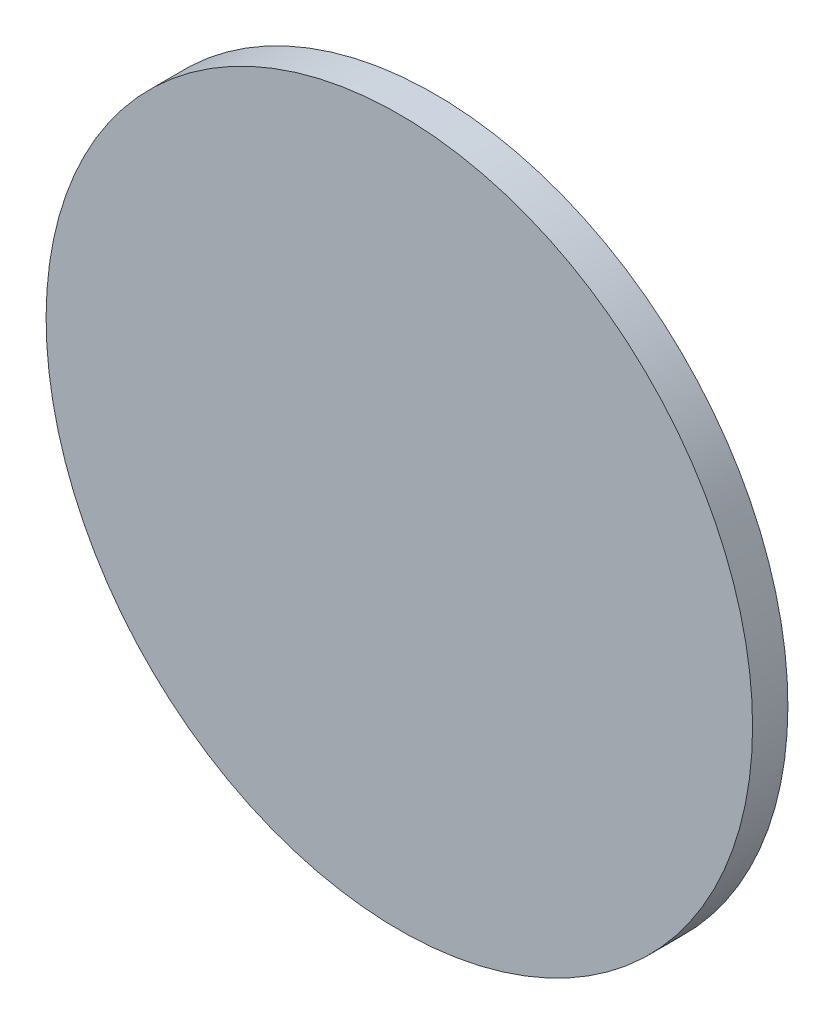
ISO-10303-21;
HEADER;
FILE_DESCRIPTION(('STEP AP214'),'2;1');
FILE_NAME('part.step','',(''),(''),'','','');
FILE_SCHEMA(('AUTOMOTIVE_DESIGN { 1 0 10303 214 1 1 1 1 }'));
ENDSEC;
DATA;
#1=APPLICATION_CONTEXT('core data for automotive mechanical design processes');
#2=APPLICATION_PROTOCOL_DEFINITION('international standard','automotive_design',2000,#1);
#3=PRODUCT_CONTEXT('',#1,'mechanical');
#4=PRODUCT('Part','Part','',(#3));
#5=PRODUCT_RELATED_PRODUCT_CATEGORY('part','',(#4));
#6=PRODUCT_DEFINITION_FORMATION('','',#4);
#7=PRODUCT_DEFINITION_CONTEXT('part definition',#1,'design');
#8=PRODUCT_DEFINITION('design','',#6,#7);
#9=PRODUCT_DEFINITION_SHAPE('','',#8);
#10=(LENGTH_UNIT() NAMED_UNIT(*) SI_UNIT(.MILLI.,.METRE.));
#11=(NAMED_UNIT(*) PLANE_ANGLE_UNIT() SI_UNIT($,.RADIAN.));
#12=(NAMED_UNIT(*) SI_UNIT($,.STERADIAN.) SOLID_ANGLE_UNIT());
#13=UNCERTAINTY_MEASURE_WITH_UNIT(LENGTH_MEASURE(1.E-05),#10,'distance_accuracy_value','');
#14=(GEOMETRIC_REPRESENTATION_CONTEXT(3) GLOBAL_UNCERTAINTY_ASSIGNED_CONTEXT((#13)) GLOBAL_UNIT_ASSIGNED_CONTEXT((#10,
#11,#12)) REPRESENTATION_CONTEXT('',''));
#15=CARTESIAN_POINT('',(0.,0.,0.));
#16=DIRECTION('',(0.,0.,1.));
#17=DIRECTION('',(1.,0.,0.));
#18=AXIS2_PLACEMENT_3D('',#15,#16,#17);
#19=CARTESIAN_POINT('',(19.8104450030768,-19.8104450030789,23.8077500000002));
#20=DIRECTION('',(0.,0.,-1.));
#21=DIRECTION('',(0.858693395429852,-0.512489661012935,0.));
#22=AXIS2_PLACEMENT_3D('',#19,#20,#21);
#23=PLANE('',#22);
#24=CARTESIAN_POINT('',(19.8104450030768,-19.8104450030789,23.8077500000002));
#25=DIRECTION('',(0.,0.,-1.));
#26=DIRECTION('',(0.858693395429852,-0.512489661012935,0.));
#27=AXIS2_PLACEMENT_3D('',#24,#25,#26);
#28=CIRCLE('',#27,6.35);
#29=CARTESIAN_POINT('',(25.2631480640563,-23.064754350511,23.8077500000002));
#30=VERTEX_POINT('',#29);
#31=EDGE_CURVE('E10',#30,#30,#28,.T.);
#32=ORIENTED_EDGE('',*,*,#31,.F.);
#33=EDGE_LOOP('',(#32));
#34=FACE_BOUND('',#33,.T.);
#35=ADVANCED_FACE('F15',(#34),#23,.F.);
#36=CARTESIAN_POINT('',(19.8104450030768,-19.8104450030789,23.1727500000002));
#37=DIRECTION('',(0.,0.,-1.));
#38=DIRECTION('',(0.858693395429852,-0.512489661012935,0.));
#39=AXIS2_PLACEMENT_3D('',#36,#37,#38);
#40=PLANE('',#39);
#41=CARTESIAN_POINT('',(19.8104450030768,-19.8104450030789,23.1727500000002));
#42=DIRECTION('',(0.,0.,-1.));
#43=DIRECTION('',(0.858693395429852,-0.512489661012935,0.));
#44=AXIS2_PLACEMENT_3D('',#41,#42,#43);
#45=CIRCLE('',#44,6.35);
#46=CARTESIAN_POINT('',(25.2631480640563,-23.064754350511,23.1727500000002));
#47=VERTEX_POINT('',#46);
#48=EDGE_CURVE('E22',#47,#47,#45,.T.);
#49=ORIENTED_EDGE('',*,*,#48,.T.);
#50=EDGE_LOOP('',(#49));
#51=FACE_BOUND('',#50,.T.);
#52=ADVANCED_FACE('F30',(#51),#40,.T.);
#53=CARTESIAN_POINT('',(19.8104450030768,-19.8104450030789,23.1727500000002));
#54=DIRECTION('',(0.,0.,1.));
#55=DIRECTION('',(-0.858693395429852,0.512489661012935,0.));
#56=AXIS2_PLACEMENT_3D('',#53,#54,#55);
#57=CYLINDRICAL_SURFACE('',#56,6.35);
#58=ORIENTED_EDGE('',*,*,#31,.T.);
#59=EDGE_LOOP('',(#58));
#60=FACE_BOUND('',#59,.T.);
#61=ORIENTED_EDGE('',*,*,#48,.F.);
#62=EDGE_LOOP('',(#61));
#63=FACE_BOUND('',#62,.T.);
#64=ADVANCED_FACE('F32',(#60,#63),#57,.T.);
#65=CLOSED_SHELL('',(#35,#52,#64));
#66=MANIFOLD_SOLID_BREP('B1',#65);
#67=ADVANCED_BREP_SHAPE_REPRESENTATION('',(#18,#66),#14);
#68=SHAPE_DEFINITION_REPRESENTATION(#9,#67);
ENDSEC;
END-ISO-10303-21;
